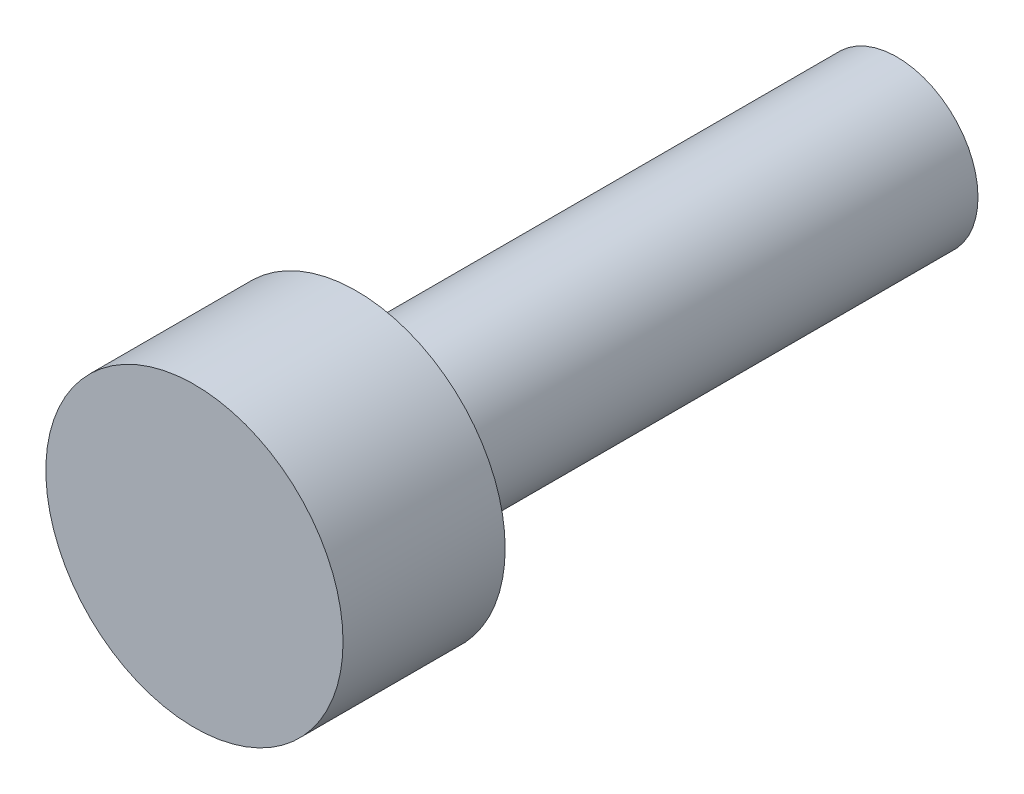
ISO-10303-21;
HEADER;
FILE_DESCRIPTION(('STEP AP214'),'2;1');
FILE_NAME('part.step','',(''),(''),'','','');
FILE_SCHEMA(('AUTOMOTIVE_DESIGN { 1 0 10303 214 1 1 1 1 }'));
ENDSEC;
DATA;
#1=APPLICATION_CONTEXT('core data for automotive mechanical design processes');
#2=APPLICATION_PROTOCOL_DEFINITION('international standard','automotive_design',2000,#1);
#3=PRODUCT_CONTEXT('',#1,'mechanical');
#4=PRODUCT('Part','Part','',(#3));
#5=PRODUCT_RELATED_PRODUCT_CATEGORY('part','',(#4));
#6=PRODUCT_DEFINITION_FORMATION('','',#4);
#7=PRODUCT_DEFINITION_CONTEXT('part definition',#1,'design');
#8=PRODUCT_DEFINITION('design','',#6,#7);
#9=PRODUCT_DEFINITION_SHAPE('','',#8);
#10=(LENGTH_UNIT() NAMED_UNIT(*) SI_UNIT(.MILLI.,.METRE.));
#11=(NAMED_UNIT(*) PLANE_ANGLE_UNIT() SI_UNIT($,.RADIAN.));
#12=(NAMED_UNIT(*) SI_UNIT($,.STERADIAN.) SOLID_ANGLE_UNIT());
#13=UNCERTAINTY_MEASURE_WITH_UNIT(LENGTH_MEASURE(1.E-05),#10,'distance_accuracy_value','');
#14=(GEOMETRIC_REPRESENTATION_CONTEXT(3) GLOBAL_UNCERTAINTY_ASSIGNED_CONTEXT((#13)) GLOBAL_UNIT_ASSIGNED_CONTEXT((#10,
#11,#12)) REPRESENTATION_CONTEXT('',''));
#15=CARTESIAN_POINT('',(0.,0.,0.));
#16=DIRECTION('',(0.,0.,1.));
#17=DIRECTION('',(1.,0.,0.));
#18=AXIS2_PLACEMENT_3D('',#15,#16,#17);
#19=CARTESIAN_POINT('',(0.,0.,10.));
#20=DIRECTION('',(0.,0.,-1.));
#21=DIRECTION('',(-1.,0.,0.));
#22=AXIS2_PLACEMENT_3D('',#19,#20,#21);
#23=CYLINDRICAL_SURFACE('',#22,1.5);
#24=CARTESIAN_POINT('',(0.,0.,10.));
#25=DIRECTION('',(0.,0.,1.));
#26=DIRECTION('',(1.,0.,0.));
#27=AXIS2_PLACEMENT_3D('',#24,#25,#26);
#28=CIRCLE('',#27,1.5);
#29=CARTESIAN_POINT('',(1.5,0.,10.));
#30=VERTEX_POINT('',#29);
#31=EDGE_CURVE('E10',#30,#30,#28,.T.);
#32=ORIENTED_EDGE('',*,*,#31,.F.);
#33=EDGE_LOOP('',(#32));
#34=FACE_BOUND('',#33,.T.);
#35=CARTESIAN_POINT('',(0.,0.,0.));
#36=DIRECTION('',(0.,0.,1.));
#37=DIRECTION('',(1.,0.,0.));
#38=AXIS2_PLACEMENT_3D('',#35,#36,#37);
#39=CIRCLE('',#38,1.5);
#40=CARTESIAN_POINT('',(1.5,0.,0.));
#41=VERTEX_POINT('',#40);
#42=EDGE_CURVE('E40',#41,#41,#39,.T.);
#43=ORIENTED_EDGE('',*,*,#42,.T.);
#44=EDGE_LOOP('',(#43));
#45=FACE_BOUND('',#44,.T.);
#46=ADVANCED_FACE('F37',(#34,#45),#23,.T.);
#47=CARTESIAN_POINT('',(0.,0.,0.));
#48=DIRECTION('',(0.,0.,1.));
#49=DIRECTION('',(1.,0.,0.));
#50=AXIS2_PLACEMENT_3D('',#47,#48,#49);
#51=PLANE('',#50);
#52=ORIENTED_EDGE('',*,*,#42,.F.);
#53=EDGE_LOOP('',(#52));
#54=FACE_BOUND('',#53,.T.);
#55=ADVANCED_FACE('F60',(#54),#51,.F.);
#56=CARTESIAN_POINT('',(0.,0.,13.));
#57=DIRECTION('',(0.,0.,-1.));
#58=DIRECTION('',(-1.,0.,0.));
#59=AXIS2_PLACEMENT_3D('',#56,#57,#58);
#60=CYLINDRICAL_SURFACE('',#59,2.75);
#61=CARTESIAN_POINT('',(0.,0.,13.));
#62=DIRECTION('',(0.,0.,1.));
#63=DIRECTION('',(1.,0.,0.));
#64=AXIS2_PLACEMENT_3D('',#61,#62,#63);
#65=CIRCLE('',#64,2.75);
#66=CARTESIAN_POINT('',(2.75,0.,13.));
#67=VERTEX_POINT('',#66);
#68=EDGE_CURVE('E47',#67,#67,#65,.T.);
#69=ORIENTED_EDGE('',*,*,#68,.F.);
#70=EDGE_LOOP('',(#69));
#71=FACE_BOUND('',#70,.T.);
#72=CARTESIAN_POINT('',(0.,0.,10.));
#73=DIRECTION('',(0.,0.,1.));
#74=DIRECTION('',(1.,0.,0.));
#75=AXIS2_PLACEMENT_3D('',#72,#73,#74);
#76=CIRCLE('',#75,2.75);
#77=CARTESIAN_POINT('',(2.75,0.,10.));
#78=VERTEX_POINT('',#77);
#79=EDGE_CURVE('E49',#78,#78,#76,.T.);
#80=ORIENTED_EDGE('',*,*,#79,.T.);
#81=EDGE_LOOP('',(#80));
#82=FACE_BOUND('',#81,.T.);
#83=ADVANCED_FACE('F57',(#71,#82),#60,.T.);
#84=CARTESIAN_POINT('',(0.,0.,13.));
#85=DIRECTION('',(0.,0.,1.));
#86=DIRECTION('',(1.,0.,0.));
#87=AXIS2_PLACEMENT_3D('',#84,#85,#86);
#88=PLANE('',#87);
#89=ORIENTED_EDGE('',*,*,#68,.T.);
#90=EDGE_LOOP('',(#89));
#91=FACE_BOUND('',#90,.T.);
#92=ADVANCED_FACE('F55',(#91),#88,.T.);
#93=CARTESIAN_POINT('',(0.,0.,10.));
#94=DIRECTION('',(0.,0.,1.));
#95=DIRECTION('',(1.,0.,0.));
#96=AXIS2_PLACEMENT_3D('',#93,#94,#95);
#97=PLANE('',#96);
#98=ORIENTED_EDGE('',*,*,#31,.T.);
#99=EDGE_LOOP('',(#98));
#100=FACE_BOUND('',#99,.T.);
#101=ORIENTED_EDGE('',*,*,#79,.F.);
#102=EDGE_LOOP('',(#101));
#103=FACE_BOUND('',#102,.T.);
#104=ADVANCED_FACE('F64',(#100,#103),#97,.F.);
#105=CLOSED_SHELL('',(#46,#55,#83,#92,#104));
#106=MANIFOLD_SOLID_BREP('B2',#105);
#107=ADVANCED_BREP_SHAPE_REPRESENTATION('',(#18,#106),#14);
#108=SHAPE_DEFINITION_REPRESENTATION(#9,#107);
ENDSEC;
END-ISO-10303-21;
